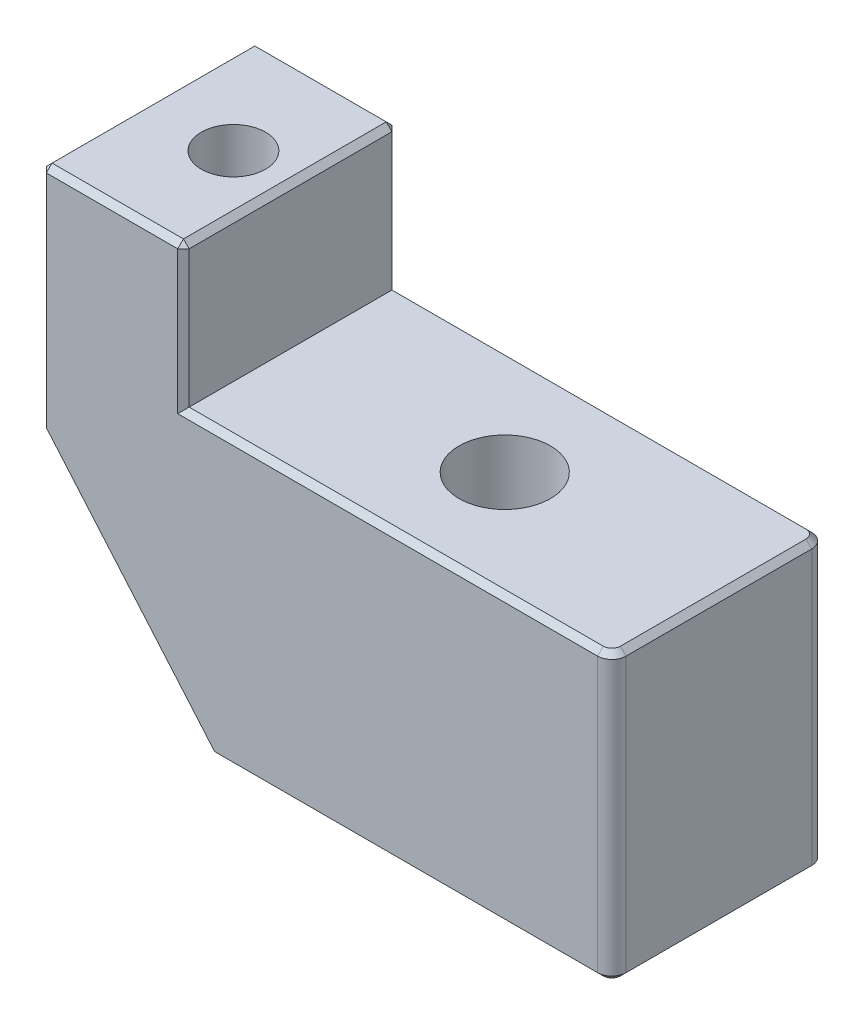
ISO-10303-21;
HEADER;
FILE_DESCRIPTION(('STEP AP214'),'2;1');
FILE_NAME('part.step','',(''),(''),'','','');
FILE_SCHEMA(('AUTOMOTIVE_DESIGN { 1 0 10303 214 1 1 1 1 }'));
ENDSEC;
DATA;
#1=APPLICATION_CONTEXT('core data for automotive mechanical design processes');
#2=APPLICATION_PROTOCOL_DEFINITION('international standard','automotive_design',2000,#1);
#3=PRODUCT_CONTEXT('',#1,'mechanical');
#4=PRODUCT('Part','Part','',(#3));
#5=PRODUCT_RELATED_PRODUCT_CATEGORY('part','',(#4));
#6=PRODUCT_DEFINITION_FORMATION('','',#4);
#7=PRODUCT_DEFINITION_CONTEXT('part definition',#1,'design');
#8=PRODUCT_DEFINITION('design','',#6,#7);
#9=PRODUCT_DEFINITION_SHAPE('','',#8);
#10=(LENGTH_UNIT() NAMED_UNIT(*) SI_UNIT(.MILLI.,.METRE.));
#11=(NAMED_UNIT(*) PLANE_ANGLE_UNIT() SI_UNIT($,.RADIAN.));
#12=(NAMED_UNIT(*) SI_UNIT($,.STERADIAN.) SOLID_ANGLE_UNIT());
#13=UNCERTAINTY_MEASURE_WITH_UNIT(LENGTH_MEASURE(1.E-05),#10,'distance_accuracy_value','');
#14=(GEOMETRIC_REPRESENTATION_CONTEXT(3) GLOBAL_UNCERTAINTY_ASSIGNED_CONTEXT((#13)) GLOBAL_UNIT_ASSIGNED_CONTEXT((#10,
#11,#12)) REPRESENTATION_CONTEXT('',''));
#15=CARTESIAN_POINT('',(0.,0.,0.));
#16=DIRECTION('',(0.,0.,1.));
#17=DIRECTION('',(1.,0.,0.));
#18=AXIS2_PLACEMENT_3D('',#15,#16,#17);
#19=CARTESIAN_POINT('',(0.,16.,7.5));
#20=DIRECTION('',(0.,-1.,0.));
#21=DIRECTION('',(0.,0.,-1.));
#22=AXIS2_PLACEMENT_3D('',#19,#20,#21);
#23=PLANE('',#22);
#24=DIRECTION('',(-1.,0.,0.));
#25=VECTOR('',#24,1.);
#26=CARTESIAN_POINT('',(0.,16.,-7.09999999999998));
#27=LINE('',#26,#25);
#28=CARTESIAN_POINT('',(9.59999999999998,16.,-7.09999999999998));
#29=VERTEX_POINT('',#28);
#30=CARTESIAN_POINT('',(0.400000000000018,16.,-7.09999999999998));
#31=VERTEX_POINT('',#30);
#32=EDGE_CURVE('E281',#29,#31,#27,.T.);
#33=ORIENTED_EDGE('',*,*,#32,.T.);
#34=DIRECTION('',(0.,0.,1.));
#35=VECTOR('',#34,1.);
#36=CARTESIAN_POINT('',(0.400000000000018,16.,7.5));
#37=LINE('',#36,#35);
#38=CARTESIAN_POINT('',(0.400000000000018,16.,7.09999999999998));
#39=VERTEX_POINT('',#38);
#40=EDGE_CURVE('E283',#31,#39,#37,.T.);
#41=ORIENTED_EDGE('',*,*,#40,.T.);
#42=DIRECTION('',(1.,0.,0.));
#43=VECTOR('',#42,1.);
#44=CARTESIAN_POINT('',(10.,16.,7.09999999999998));
#45=LINE('',#44,#43);
#46=CARTESIAN_POINT('',(9.59999999999998,16.,7.09999999999998));
#47=VERTEX_POINT('',#46);
#48=EDGE_CURVE('E279',#39,#47,#45,.T.);
#49=ORIENTED_EDGE('',*,*,#48,.T.);
#50=DIRECTION('',(0.,0.,-1.));
#51=VECTOR('',#50,1.);
#52=CARTESIAN_POINT('',(9.59999999999998,16.,7.5));
#53=LINE('',#52,#51);
#54=EDGE_CURVE('E277',#47,#29,#53,.T.);
#55=ORIENTED_EDGE('',*,*,#54,.T.);
#56=EDGE_LOOP('',(#33,#41,#49,#55));
#57=FACE_BOUND('',#56,.T.);
#58=CARTESIAN_POINT('',(6.,16.,0.));
#59=DIRECTION('',(0.,-1.,0.));
#60=DIRECTION('',(0.,0.,-1.));
#61=AXIS2_PLACEMENT_3D('',#58,#59,#60);
#62=CIRCLE('',#61,2.24999999999999);
#63=CARTESIAN_POINT('',(6.,16.,-2.24999999999999));
#64=VERTEX_POINT('',#63);
#65=EDGE_CURVE('E366',#64,#64,#62,.T.);
#66=ORIENTED_EDGE('',*,*,#65,.T.);
#67=EDGE_LOOP('',(#66));
#68=FACE_BOUND('',#67,.T.);
#69=ADVANCED_FACE('F39',(#57,#68),#23,.F.);
#70=CARTESIAN_POINT('',(12.,-14.,7.5));
#71=DIRECTION('',(0.,1.,0.));
#72=DIRECTION('',(0.,0.,1.));
#73=AXIS2_PLACEMENT_3D('',#70,#71,#72);
#74=PLANE('',#73);
#75=CARTESIAN_POINT('',(39.,-14.,6.5));
#76=DIRECTION('',(0.,1.,0.));
#77=DIRECTION('',(0.,0.,1.));
#78=AXIS2_PLACEMENT_3D('',#75,#76,#77);
#79=CIRCLE('',#78,0.599999999999982);
#80=CARTESIAN_POINT('',(39.6,-14.,6.5));
#81=VERTEX_POINT('',#80);
#82=CARTESIAN_POINT('',(39.,-14.,7.09999999999998));
#83=VERTEX_POINT('',#82);
#84=EDGE_CURVE('E242',#81,#83,#79,.F.);
#85=ORIENTED_EDGE('',*,*,#84,.T.);
#86=DIRECTION('',(-1.,0.,0.));
#87=VECTOR('',#86,1.);
#88=CARTESIAN_POINT('',(12.,-14.,7.09999999999998));
#89=LINE('',#88,#87);
#90=CARTESIAN_POINT('',(12.,-14.,7.09999999999998));
#91=VERTEX_POINT('',#90);
#92=EDGE_CURVE('E244',#83,#91,#89,.T.);
#93=ORIENTED_EDGE('',*,*,#92,.T.);
#94=DIRECTION('',(0.,0.,-1.));
#95=VECTOR('',#94,1.);
#96=CARTESIAN_POINT('',(12.,-14.,7.5));
#97=LINE('',#96,#95);
#98=CARTESIAN_POINT('',(12.,-14.,-7.09999999999998));
#99=VERTEX_POINT('',#98);
#100=EDGE_CURVE('E188',#91,#99,#97,.T.);
#101=ORIENTED_EDGE('',*,*,#100,.T.);
#102=DIRECTION('',(1.,0.,0.));
#103=VECTOR('',#102,1.);
#104=CARTESIAN_POINT('',(12.,-14.,-7.09999999999998));
#105=LINE('',#104,#103);
#106=CARTESIAN_POINT('',(39.,-14.,-7.09999999999998));
#107=VERTEX_POINT('',#106);
#108=EDGE_CURVE('E236',#99,#107,#105,.T.);
#109=ORIENTED_EDGE('',*,*,#108,.T.);
#110=CARTESIAN_POINT('',(39.,-14.,-6.5));
#111=DIRECTION('',(0.,1.,0.));
#112=DIRECTION('',(0.,0.,1.));
#113=AXIS2_PLACEMENT_3D('',#110,#111,#112);
#114=CIRCLE('',#113,0.599999999999983);
#115=CARTESIAN_POINT('',(39.6,-14.,-6.5));
#116=VERTEX_POINT('',#115);
#117=EDGE_CURVE('E238',#107,#116,#114,.F.);
#118=ORIENTED_EDGE('',*,*,#117,.T.);
#119=DIRECTION('',(0.,0.,1.));
#120=VECTOR('',#119,1.);
#121=CARTESIAN_POINT('',(39.6,-14.,7.5));
#122=LINE('',#121,#120);
#123=EDGE_CURVE('E240',#116,#81,#122,.T.);
#124=ORIENTED_EDGE('',*,*,#123,.T.);
#125=EDGE_LOOP('',(#85,#93,#101,#109,#118,#124));
#126=FACE_BOUND('',#125,.T.);
#127=CARTESIAN_POINT('',(25.,-14.,0.));
#128=DIRECTION('',(0.,-1.,0.));
#129=DIRECTION('',(0.,0.,-1.));
#130=AXIS2_PLACEMENT_3D('',#127,#128,#129);
#131=CIRCLE('',#130,5.5);
#132=CARTESIAN_POINT('',(25.,-14.,-5.49999999999999));
#133=VERTEX_POINT('',#132);
#134=EDGE_CURVE('E372',#133,#133,#131,.T.);
#135=ORIENTED_EDGE('',*,*,#134,.F.);
#136=EDGE_LOOP('',(#135));
#137=FACE_BOUND('',#136,.T.);
#138=ADVANCED_FACE('F513',(#126,#137),#74,.F.);
#139=CARTESIAN_POINT('',(0.,0.,7.5));
#140=DIRECTION('',(0.759256602365297,0.650791373455968,0.));
#141=DIRECTION('',(-0.650791373455968,0.759256602365297,0.));
#142=AXIS2_PLACEMENT_3D('',#139,#140,#141);
#143=PLANE('',#142);
#144=CARTESIAN_POINT('',(6.,-7.,0.));
#145=DIRECTION('',(0.759256602365297,0.650791373455968,0.));
#146=DIRECTION('',(0.650791373455968,-0.759256602365297,0.));
#147=AXIS2_PLACEMENT_3D('',#144,#145,#146);
#148=ELLIPSE('',#147,6.14636297152859,4.);
#149=CARTESIAN_POINT('',(10.,-11.6666666666667,0.));
#150=VERTEX_POINT('',#149);
#151=EDGE_CURVE('E371',#150,#150,#148,.T.);
#152=ORIENTED_EDGE('',*,*,#151,.T.);
#153=EDGE_LOOP('',(#152));
#154=FACE_BOUND('',#153,.T.);
#155=ORIENTED_EDGE('',*,*,#100,.F.);
#156=DIRECTION('',(-0.650791373455968,0.759256602365297,0.));
#157=VECTOR('',#156,1.);
#158=CARTESIAN_POINT('',(0.,0.,7.09999999999998));
#159=LINE('',#158,#157);
#160=CARTESIAN_POINT('',(0.,0.,7.09999999999998));
#161=VERTEX_POINT('',#160);
#162=EDGE_CURVE('E269',#91,#161,#159,.T.);
#163=ORIENTED_EDGE('',*,*,#162,.T.);
#164=DIRECTION('',(0.,0.,-1.));
#165=VECTOR('',#164,1.);
#166=CARTESIAN_POINT('',(0.,0.,7.5));
#167=LINE('',#166,#165);
#168=CARTESIAN_POINT('',(0.,0.,-7.09999999999998));
#169=VERTEX_POINT('',#168);
#170=EDGE_CURVE('E189',#161,#169,#167,.T.);
#171=ORIENTED_EDGE('',*,*,#170,.T.);
#172=DIRECTION('',(0.650791373455968,-0.759256602365297,0.));
#173=VECTOR('',#172,1.);
#174=CARTESIAN_POINT('',(0.,0.,-7.09999999999998));
#175=LINE('',#174,#173);
#176=EDGE_CURVE('E267',#169,#99,#175,.T.);
#177=ORIENTED_EDGE('',*,*,#176,.T.);
#178=EDGE_LOOP('',(#155,#163,#171,#177));
#179=FACE_BOUND('',#178,.T.);
#180=ADVANCED_FACE('F476',(#154,#179),#143,.F.);
#181=CARTESIAN_POINT('',(40.,6.,7.5));
#182=DIRECTION('',(-1.,0.,0.));
#183=DIRECTION('',(0.,-1.,0.));
#184=AXIS2_PLACEMENT_3D('',#181,#182,#183);
#185=PLANE('',#184);
#186=DIRECTION('',(0.,1.,0.));
#187=VECTOR('',#186,1.);
#188=CARTESIAN_POINT('',(40.,6.,-6.5));
#189=LINE('',#188,#187);
#190=CARTESIAN_POINT('',(40.,-13.6,-6.5));
#191=VERTEX_POINT('',#190);
#192=CARTESIAN_POINT('',(40.,5.59999999999998,-6.5));
#193=VERTEX_POINT('',#192);
#194=EDGE_CURVE('E393',#191,#193,#189,.T.);
#195=ORIENTED_EDGE('',*,*,#194,.T.);
#196=DIRECTION('',(0.,0.,1.));
#197=VECTOR('',#196,1.);
#198=CARTESIAN_POINT('',(40.,5.6,7.5));
#199=LINE('',#198,#197);
#200=CARTESIAN_POINT('',(40.,5.59999999999998,6.5));
#201=VERTEX_POINT('',#200);
#202=EDGE_CURVE('E222',#193,#201,#199,.T.);
#203=ORIENTED_EDGE('',*,*,#202,.T.);
#204=DIRECTION('',(0.,1.,0.));
#205=VECTOR('',#204,1.);
#206=CARTESIAN_POINT('',(40.,-14.,6.5));
#207=LINE('',#206,#205);
#208=CARTESIAN_POINT('',(40.,-13.6,6.5));
#209=VERTEX_POINT('',#208);
#210=EDGE_CURVE('E388',#201,#209,#207,.F.);
#211=ORIENTED_EDGE('',*,*,#210,.T.);
#212=DIRECTION('',(0.,0.,-1.));
#213=VECTOR('',#212,1.);
#214=CARTESIAN_POINT('',(40.,-13.6,7.5));
#215=LINE('',#214,#213);
#216=EDGE_CURVE('E220',#209,#191,#215,.T.);
#217=ORIENTED_EDGE('',*,*,#216,.T.);
#218=EDGE_LOOP('',(#195,#203,#211,#217));
#219=FACE_BOUND('',#218,.T.);
#220=ADVANCED_FACE('F447',(#219),#185,.F.);
#221=CARTESIAN_POINT('',(10.,6.,7.5));
#222=DIRECTION('',(0.,-1.,0.));
#223=DIRECTION('',(0.,0.,-1.));
#224=AXIS2_PLACEMENT_3D('',#221,#222,#223);
#225=PLANE('',#224);
#226=CARTESIAN_POINT('',(25.,6.,0.));
#227=DIRECTION('',(0.,-1.,0.));
#228=DIRECTION('',(0.,0.,-1.));
#229=AXIS2_PLACEMENT_3D('',#226,#227,#228);
#230=CIRCLE('',#229,3.2);
#231=CARTESIAN_POINT('',(25.,6.,-3.19999999999999));
#232=VERTEX_POINT('',#231);
#233=EDGE_CURVE('E381',#232,#232,#230,.T.);
#234=ORIENTED_EDGE('',*,*,#233,.T.);
#235=EDGE_LOOP('',(#234));
#236=FACE_BOUND('',#235,.T.);
#237=CARTESIAN_POINT('',(39.,6.,-6.5));
#238=DIRECTION('',(0.,-1.,0.));
#239=DIRECTION('',(0.,0.,-1.));
#240=AXIS2_PLACEMENT_3D('',#237,#238,#239);
#241=CIRCLE('',#240,0.599999999999982);
#242=CARTESIAN_POINT('',(39.6,6.,-6.5));
#243=VERTEX_POINT('',#242);
#244=CARTESIAN_POINT('',(39.,6.,-7.09999999999998));
#245=VERTEX_POINT('',#244);
#246=EDGE_CURVE('E217',#243,#245,#241,.F.);
#247=ORIENTED_EDGE('',*,*,#246,.T.);
#248=DIRECTION('',(-1.,0.,0.));
#249=VECTOR('',#248,1.);
#250=CARTESIAN_POINT('',(10.,6.,-7.09999999999998));
#251=LINE('',#250,#249);
#252=CARTESIAN_POINT('',(10.,6.,-7.09999999999998));
#253=VERTEX_POINT('',#252);
#254=EDGE_CURVE('E187',#245,#253,#251,.T.);
#255=ORIENTED_EDGE('',*,*,#254,.T.);
#256=DIRECTION('',(0.,0.,-1.));
#257=VECTOR('',#256,1.);
#258=CARTESIAN_POINT('',(10.,6.,7.5));
#259=LINE('',#258,#257);
#260=CARTESIAN_POINT('',(10.,6.,7.09999999999998));
#261=VERTEX_POINT('',#260);
#262=EDGE_CURVE('E176',#261,#253,#259,.T.);
#263=ORIENTED_EDGE('',*,*,#262,.F.);
#264=DIRECTION('',(1.,0.,0.));
#265=VECTOR('',#264,1.);
#266=CARTESIAN_POINT('',(39.,6.,7.09999999999998));
#267=LINE('',#266,#265);
#268=CARTESIAN_POINT('',(39.,6.,7.09999999999998));
#269=VERTEX_POINT('',#268);
#270=EDGE_CURVE('E184',#261,#269,#267,.T.);
#271=ORIENTED_EDGE('',*,*,#270,.T.);
#272=CARTESIAN_POINT('',(39.,6.,6.5));
#273=DIRECTION('',(0.,-1.,0.));
#274=DIRECTION('',(0.,0.,-1.));
#275=AXIS2_PLACEMENT_3D('',#272,#273,#274);
#276=CIRCLE('',#275,0.599999999999983);
#277=CARTESIAN_POINT('',(39.6,6.,6.5));
#278=VERTEX_POINT('',#277);
#279=EDGE_CURVE('E205',#269,#278,#276,.F.);
#280=ORIENTED_EDGE('',*,*,#279,.T.);
#281=DIRECTION('',(0.,0.,-1.));
#282=VECTOR('',#281,1.);
#283=CARTESIAN_POINT('',(39.6,6.,7.5));
#284=LINE('',#283,#282);
#285=EDGE_CURVE('E208',#278,#243,#284,.T.);
#286=ORIENTED_EDGE('',*,*,#285,.T.);
#287=EDGE_LOOP('',(#247,#255,#263,#271,#280,#286));
#288=FACE_BOUND('',#287,.T.);
#289=ADVANCED_FACE('F182',(#236,#288),#225,.F.);
#290=CARTESIAN_POINT('',(10.,16.,7.5));
#291=DIRECTION('',(-1.,0.,0.));
#292=DIRECTION('',(0.,-1.,0.));
#293=AXIS2_PLACEMENT_3D('',#290,#291,#292);
#294=PLANE('',#293);
#295=ORIENTED_EDGE('',*,*,#262,.T.);
#296=DIRECTION('',(0.,1.,0.));
#297=VECTOR('',#296,1.);
#298=CARTESIAN_POINT('',(10.,16.,-7.09999999999998));
#299=LINE('',#298,#297);
#300=CARTESIAN_POINT('',(10.,15.6,-7.09999999999998));
#301=VERTEX_POINT('',#300);
#302=EDGE_CURVE('E11',#253,#301,#299,.T.);
#303=ORIENTED_EDGE('',*,*,#302,.T.);
#304=DIRECTION('',(0.,0.,1.));
#305=VECTOR('',#304,1.);
#306=CARTESIAN_POINT('',(10.,15.6,7.5));
#307=LINE('',#306,#305);
#308=CARTESIAN_POINT('',(10.,15.6,7.09999999999998));
#309=VERTEX_POINT('',#308);
#310=EDGE_CURVE('E56',#301,#309,#307,.T.);
#311=ORIENTED_EDGE('',*,*,#310,.T.);
#312=DIRECTION('',(0.,-1.,0.));
#313=VECTOR('',#312,1.);
#314=CARTESIAN_POINT('',(10.,6.,7.09999999999998));
#315=LINE('',#314,#313);
#316=EDGE_CURVE('E49',#309,#261,#315,.T.);
#317=ORIENTED_EDGE('',*,*,#316,.T.);
#318=EDGE_LOOP('',(#295,#303,#311,#317));
#319=FACE_BOUND('',#318,.T.);
#320=ADVANCED_FACE('F175',(#319),#294,.F.);
#321=CARTESIAN_POINT('',(0.,0.,7.5));
#322=DIRECTION('',(1.,0.,0.));
#323=DIRECTION('',(0.,0.,-1.));
#324=AXIS2_PLACEMENT_3D('',#321,#322,#323);
#325=PLANE('',#324);
#326=ORIENTED_EDGE('',*,*,#170,.F.);
#327=DIRECTION('',(0.,1.,0.));
#328=VECTOR('',#327,1.);
#329=CARTESIAN_POINT('',(0.,16.,7.09999999999998));
#330=LINE('',#329,#328);
#331=CARTESIAN_POINT('',(0.,15.6,7.09999999999998));
#332=VERTEX_POINT('',#331);
#333=EDGE_CURVE('E275',#161,#332,#330,.T.);
#334=ORIENTED_EDGE('',*,*,#333,.T.);
#335=DIRECTION('',(0.,0.,-1.));
#336=VECTOR('',#335,1.);
#337=CARTESIAN_POINT('',(0.,15.6,7.5));
#338=LINE('',#337,#336);
#339=CARTESIAN_POINT('',(0.,15.6,-7.09999999999998));
#340=VERTEX_POINT('',#339);
#341=EDGE_CURVE('E271',#332,#340,#338,.T.);
#342=ORIENTED_EDGE('',*,*,#341,.T.);
#343=DIRECTION('',(0.,-1.,0.));
#344=VECTOR('',#343,1.);
#345=CARTESIAN_POINT('',(0.,0.,-7.09999999999998));
#346=LINE('',#345,#344);
#347=EDGE_CURVE('E273',#340,#169,#346,.T.);
#348=ORIENTED_EDGE('',*,*,#347,.T.);
#349=EDGE_LOOP('',(#326,#334,#342,#348));
#350=FACE_BOUND('',#349,.T.);
#351=ADVANCED_FACE('F478',(#350),#325,.F.);
#352=CARTESIAN_POINT('',(0.,0.,7.5));
#353=DIRECTION('',(0.,0.,1.));
#354=DIRECTION('',(1.,0.,0.));
#355=AXIS2_PLACEMENT_3D('',#352,#353,#354);
#356=PLANE('',#355);
#357=DIRECTION('',(0.650791373455969,-0.759256602365297,0.));
#358=VECTOR('',#357,1.);
#359=CARTESIAN_POINT('',(12.3037026409461,-13.7396834506176,7.5));
#360=LINE('',#359,#358);
#361=CARTESIAN_POINT('',(0.400000000000018,0.147969630486194,7.5));
#362=VERTEX_POINT('',#361);
#363=CARTESIAN_POINT('',(12.1839739689882,-13.6,7.5));
#364=VERTEX_POINT('',#363);
#365=EDGE_CURVE('E232',#362,#364,#360,.T.);
#366=ORIENTED_EDGE('',*,*,#365,.T.);
#367=DIRECTION('',(1.,0.,0.));
#368=VECTOR('',#367,1.);
#369=CARTESIAN_POINT('',(39.,-13.6,7.5));
#370=LINE('',#369,#368);
#371=CARTESIAN_POINT('',(39.,-13.6,7.5));
#372=VERTEX_POINT('',#371);
#373=EDGE_CURVE('E234',#364,#372,#370,.T.);
#374=ORIENTED_EDGE('',*,*,#373,.T.);
#375=DIRECTION('',(0.,1.,0.));
#376=VECTOR('',#375,1.);
#377=CARTESIAN_POINT('',(39.,6.,7.5));
#378=LINE('',#377,#376);
#379=CARTESIAN_POINT('',(39.,5.59999999999998,7.5));
#380=VERTEX_POINT('',#379);
#381=EDGE_CURVE('E206',#372,#380,#378,.T.);
#382=ORIENTED_EDGE('',*,*,#381,.T.);
#383=DIRECTION('',(-1.,0.,0.));
#384=VECTOR('',#383,1.);
#385=CARTESIAN_POINT('',(10.,5.59999999999998,7.5));
#386=LINE('',#385,#384);
#387=CARTESIAN_POINT('',(9.59999999999999,5.59999999999998,7.5));
#388=VERTEX_POINT('',#387);
#389=EDGE_CURVE('E228',#380,#388,#386,.T.);
#390=ORIENTED_EDGE('',*,*,#389,.T.);
#391=DIRECTION('',(0.,1.,0.));
#392=VECTOR('',#391,1.);
#393=CARTESIAN_POINT('',(9.59999999999998,16.,7.5));
#394=LINE('',#393,#392);
#395=CARTESIAN_POINT('',(9.59999999999998,15.6,7.5));
#396=VERTEX_POINT('',#395);
#397=EDGE_CURVE('E195',#388,#396,#394,.T.);
#398=ORIENTED_EDGE('',*,*,#397,.T.);
#399=DIRECTION('',(-1.,0.,0.));
#400=VECTOR('',#399,1.);
#401=CARTESIAN_POINT('',(0.,15.6,7.5));
#402=LINE('',#401,#400);
#403=CARTESIAN_POINT('',(0.400000000000018,15.6,7.5));
#404=VERTEX_POINT('',#403);
#405=EDGE_CURVE('E225',#396,#404,#402,.T.);
#406=ORIENTED_EDGE('',*,*,#405,.T.);
#407=DIRECTION('',(0.,-1.,0.));
#408=VECTOR('',#407,1.);
#409=CARTESIAN_POINT('',(0.400000000000018,0.,7.5));
#410=LINE('',#409,#408);
#411=EDGE_CURVE('E230',#404,#362,#410,.T.);
#412=ORIENTED_EDGE('',*,*,#411,.T.);
#413=EDGE_LOOP('',(#366,#374,#382,#390,#398,#406,#412));
#414=FACE_BOUND('',#413,.T.);
#415=ADVANCED_FACE('F461',(#414),#356,.T.);
#416=CARTESIAN_POINT('',(0.,0.,-7.5));
#417=DIRECTION('',(0.,0.,1.));
#418=DIRECTION('',(1.,0.,0.));
#419=AXIS2_PLACEMENT_3D('',#416,#417,#418);
#420=PLANE('',#419);
#421=DIRECTION('',(0.,1.,0.));
#422=VECTOR('',#421,1.);
#423=CARTESIAN_POINT('',(39.,0.,-7.5));
#424=LINE('',#423,#422);
#425=CARTESIAN_POINT('',(39.,5.59999999999998,-7.5));
#426=VERTEX_POINT('',#425);
#427=CARTESIAN_POINT('',(39.,-13.6,-7.5));
#428=VERTEX_POINT('',#427);
#429=EDGE_CURVE('E211',#426,#428,#424,.F.);
#430=ORIENTED_EDGE('',*,*,#429,.T.);
#431=DIRECTION('',(-1.,0.,0.));
#432=VECTOR('',#431,1.);
#433=CARTESIAN_POINT('',(0.,-13.6,-7.5));
#434=LINE('',#433,#432);
#435=CARTESIAN_POINT('',(12.1839739689882,-13.6,-7.5));
#436=VERTEX_POINT('',#435);
#437=EDGE_CURVE('E265',#428,#436,#434,.T.);
#438=ORIENTED_EDGE('',*,*,#437,.T.);
#439=DIRECTION('',(-0.650791373455969,0.759256602365297,0.));
#440=VECTOR('',#439,1.);
#441=CARTESIAN_POINT('',(0.303702640946132,0.260316549382399,-7.5));
#442=LINE('',#441,#440);
#443=CARTESIAN_POINT('',(0.400000000000018,0.147969630486198,-7.5));
#444=VERTEX_POINT('',#443);
#445=EDGE_CURVE('E263',#436,#444,#442,.T.);
#446=ORIENTED_EDGE('',*,*,#445,.T.);
#447=DIRECTION('',(0.,1.,0.));
#448=VECTOR('',#447,1.);
#449=CARTESIAN_POINT('',(0.400000000000018,0.,-7.5));
#450=LINE('',#449,#448);
#451=CARTESIAN_POINT('',(0.400000000000018,15.6,-7.5));
#452=VERTEX_POINT('',#451);
#453=EDGE_CURVE('E261',#444,#452,#450,.T.);
#454=ORIENTED_EDGE('',*,*,#453,.T.);
#455=DIRECTION('',(1.,0.,0.));
#456=VECTOR('',#455,1.);
#457=CARTESIAN_POINT('',(0.,15.6,-7.5));
#458=LINE('',#457,#456);
#459=CARTESIAN_POINT('',(9.59999999999998,15.6,-7.5));
#460=VERTEX_POINT('',#459);
#461=EDGE_CURVE('E255',#452,#460,#458,.T.);
#462=ORIENTED_EDGE('',*,*,#461,.T.);
#463=DIRECTION('',(0.,-1.,0.));
#464=VECTOR('',#463,1.);
#465=CARTESIAN_POINT('',(9.59999999999999,0.,-7.5));
#466=LINE('',#465,#464);
#467=CARTESIAN_POINT('',(9.59999999999999,5.59999999999998,-7.5));
#468=VERTEX_POINT('',#467);
#469=EDGE_CURVE('E257',#460,#468,#466,.T.);
#470=ORIENTED_EDGE('',*,*,#469,.T.);
#471=DIRECTION('',(1.,0.,0.));
#472=VECTOR('',#471,1.);
#473=CARTESIAN_POINT('',(0.,5.59999999999998,-7.5));
#474=LINE('',#473,#472);
#475=EDGE_CURVE('E259',#468,#426,#474,.T.);
#476=ORIENTED_EDGE('',*,*,#475,.T.);
#477=EDGE_LOOP('',(#430,#438,#446,#454,#462,#470,#476));
#478=FACE_BOUND('',#477,.T.);
#479=ADVANCED_FACE('F399',(#478),#420,.F.);
#480=CARTESIAN_POINT('',(25.,-14.,0.));
#481=DIRECTION('',(0.,-1.,0.));
#482=DIRECTION('',(0.,0.,-1.));
#483=AXIS2_PLACEMENT_3D('',#480,#481,#482);
#484=CYLINDRICAL_SURFACE('',#483,3.2);
#485=ORIENTED_EDGE('',*,*,#233,.F.);
#486=EDGE_LOOP('',(#485));
#487=FACE_BOUND('',#486,.T.);
#488=CARTESIAN_POINT('',(25.,-7.6,0.));
#489=DIRECTION('',(0.,-1.,0.));
#490=DIRECTION('',(0.,0.,-1.));
#491=AXIS2_PLACEMENT_3D('',#488,#489,#490);
#492=CIRCLE('',#491,3.2);
#493=CARTESIAN_POINT('',(25.,-7.6,-3.2));
#494=VERTEX_POINT('',#493);
#495=EDGE_CURVE('E378',#494,#494,#492,.T.);
#496=ORIENTED_EDGE('',*,*,#495,.T.);
#497=EDGE_LOOP('',(#496));
#498=FACE_BOUND('',#497,.T.);
#499=ADVANCED_FACE('F659',(#487,#498),#484,.F.);
#500=CARTESIAN_POINT('',(28.2,-7.6,0.));
#501=DIRECTION('',(0.,1.,0.));
#502=DIRECTION('',(0.,0.,1.));
#503=AXIS2_PLACEMENT_3D('',#500,#501,#502);
#504=PLANE('',#503);
#505=ORIENTED_EDGE('',*,*,#495,.F.);
#506=EDGE_LOOP('',(#505));
#507=FACE_BOUND('',#506,.T.);
#508=CARTESIAN_POINT('',(25.,-7.6,0.));
#509=DIRECTION('',(0.,-1.,0.));
#510=DIRECTION('',(0.,0.,-1.));
#511=AXIS2_PLACEMENT_3D('',#508,#509,#510);
#512=CIRCLE('',#511,5.5);
#513=CARTESIAN_POINT('',(25.,-7.6,-5.49999999999999));
#514=VERTEX_POINT('',#513);
#515=EDGE_CURVE('E375',#514,#514,#512,.T.);
#516=ORIENTED_EDGE('',*,*,#515,.T.);
#517=EDGE_LOOP('',(#516));
#518=FACE_BOUND('',#517,.T.);
#519=ADVANCED_FACE('F649',(#507,#518),#504,.F.);
#520=CARTESIAN_POINT('',(25.,-14.,0.));
#521=DIRECTION('',(0.,-1.,0.));
#522=DIRECTION('',(0.,0.,-1.));
#523=AXIS2_PLACEMENT_3D('',#520,#521,#522);
#524=CYLINDRICAL_SURFACE('',#523,5.5);
#525=ORIENTED_EDGE('',*,*,#515,.F.);
#526=EDGE_LOOP('',(#525));
#527=FACE_BOUND('',#526,.T.);
#528=ORIENTED_EDGE('',*,*,#134,.T.);
#529=EDGE_LOOP('',(#528));
#530=FACE_BOUND('',#529,.T.);
#531=ADVANCED_FACE('F646',(#527,#530),#524,.F.);
#532=CARTESIAN_POINT('',(6.,-14.,0.));
#533=DIRECTION('',(0.,-1.,0.));
#534=DIRECTION('',(0.,0.,-1.));
#535=AXIS2_PLACEMENT_3D('',#532,#533,#534);
#536=CYLINDRICAL_SURFACE('',#535,4.);
#537=CARTESIAN_POINT('',(6.,2.4,0.));
#538=DIRECTION('',(0.,-1.,0.));
#539=DIRECTION('',(0.,0.,-1.));
#540=AXIS2_PLACEMENT_3D('',#537,#538,#539);
#541=CIRCLE('',#540,4.);
#542=CARTESIAN_POINT('',(6.,2.4,-4.));
#543=VERTEX_POINT('',#542);
#544=EDGE_CURVE('E355',#543,#543,#541,.T.);
#545=ORIENTED_EDGE('',*,*,#544,.F.);
#546=EDGE_LOOP('',(#545));
#547=FACE_BOUND('',#546,.T.);
#548=ORIENTED_EDGE('',*,*,#151,.F.);
#549=EDGE_LOOP('',(#548));
#550=FACE_BOUND('',#549,.T.);
#551=ADVANCED_FACE('F648',(#547,#550),#536,.F.);
#552=CARTESIAN_POINT('',(6.,-14.,0.));
#553=DIRECTION('',(0.,-1.,0.));
#554=DIRECTION('',(0.,0.,-1.));
#555=AXIS2_PLACEMENT_3D('',#552,#553,#554);
#556=CYLINDRICAL_SURFACE('',#555,2.25);
#557=ORIENTED_EDGE('',*,*,#65,.F.);
#558=EDGE_LOOP('',(#557));
#559=FACE_BOUND('',#558,.T.);
#560=CARTESIAN_POINT('',(6.,2.4,0.));
#561=DIRECTION('',(0.,-1.,0.));
#562=DIRECTION('',(0.,0.,-1.));
#563=AXIS2_PLACEMENT_3D('',#560,#561,#562);
#564=CIRCLE('',#563,2.25);
#565=CARTESIAN_POINT('',(6.,2.4,-2.25));
#566=VERTEX_POINT('',#565);
#567=EDGE_CURVE('E361',#566,#566,#564,.T.);
#568=ORIENTED_EDGE('',*,*,#567,.T.);
#569=EDGE_LOOP('',(#568));
#570=FACE_BOUND('',#569,.T.);
#571=ADVANCED_FACE('F656',(#559,#570),#556,.F.);
#572=CARTESIAN_POINT('',(8.25,2.4,0.));
#573=DIRECTION('',(0.,1.,0.));
#574=DIRECTION('',(0.,0.,1.));
#575=AXIS2_PLACEMENT_3D('',#572,#573,#574);
#576=PLANE('',#575);
#577=ORIENTED_EDGE('',*,*,#567,.F.);
#578=EDGE_LOOP('',(#577));
#579=FACE_BOUND('',#578,.T.);
#580=ORIENTED_EDGE('',*,*,#544,.T.);
#581=EDGE_LOOP('',(#580));
#582=FACE_BOUND('',#581,.T.);
#583=ADVANCED_FACE('F535',(#579,#582),#576,.F.);
#584=CARTESIAN_POINT('',(39.,6.,-6.5));
#585=DIRECTION('',(0.,1.,0.));
#586=DIRECTION('',(-1.,0.,0.));
#587=AXIS2_PLACEMENT_3D('',#584,#585,#586);
#588=CYLINDRICAL_SURFACE('',#587,1.);
#589=ORIENTED_EDGE('',*,*,#194,.F.);
#590=CARTESIAN_POINT('',(39.,-13.6,-6.5));
#591=DIRECTION('',(0.,1.,0.));
#592=DIRECTION('',(0.,0.,1.));
#593=AXIS2_PLACEMENT_3D('',#590,#591,#592);
#594=CIRCLE('',#593,1.);
#595=EDGE_CURVE('E253',#191,#428,#594,.T.);
#596=ORIENTED_EDGE('',*,*,#595,.T.);
#597=ORIENTED_EDGE('',*,*,#429,.F.);
#598=CARTESIAN_POINT('',(39.,5.59999999999998,-6.5));
#599=DIRECTION('',(0.,-1.,0.));
#600=DIRECTION('',(0.,0.,-1.));
#601=AXIS2_PLACEMENT_3D('',#598,#599,#600);
#602=CIRCLE('',#601,1.);
#603=EDGE_CURVE('E251',#426,#193,#602,.T.);
#604=ORIENTED_EDGE('',*,*,#603,.T.);
#605=EDGE_LOOP('',(#589,#596,#597,#604));
#606=FACE_BOUND('',#605,.T.);
#607=ADVANCED_FACE('F444',(#606),#588,.T.);
#608=CARTESIAN_POINT('',(39.,0.,6.5));
#609=DIRECTION('',(0.,-1.,0.));
#610=DIRECTION('',(1.,0.,0.));
#611=AXIS2_PLACEMENT_3D('',#608,#609,#610);
#612=CYLINDRICAL_SURFACE('',#611,1.);
#613=ORIENTED_EDGE('',*,*,#381,.F.);
#614=CARTESIAN_POINT('',(39.,-13.6,6.5));
#615=DIRECTION('',(0.,1.,0.));
#616=DIRECTION('',(0.,0.,1.));
#617=AXIS2_PLACEMENT_3D('',#614,#615,#616);
#618=CIRCLE('',#617,1.);
#619=EDGE_CURVE('E249',#372,#209,#618,.T.);
#620=ORIENTED_EDGE('',*,*,#619,.T.);
#621=ORIENTED_EDGE('',*,*,#210,.F.);
#622=CARTESIAN_POINT('',(39.,5.59999999999998,6.5));
#623=DIRECTION('',(0.,-1.,0.));
#624=DIRECTION('',(0.,0.,-1.));
#625=AXIS2_PLACEMENT_3D('',#622,#623,#624);
#626=CIRCLE('',#625,1.);
#627=EDGE_CURVE('E247',#201,#380,#626,.T.);
#628=ORIENTED_EDGE('',*,*,#627,.T.);
#629=EDGE_LOOP('',(#613,#620,#621,#628));
#630=FACE_BOUND('',#629,.T.);
#631=ADVANCED_FACE('F459',(#630),#612,.T.);
#632=CARTESIAN_POINT('',(40.,-13.6,7.5));
#633=DIRECTION('',(-0.707106781186547,0.707106781186547,0.));
#634=DIRECTION('',(0.,0.,-1.));
#635=AXIS2_PLACEMENT_3D('',#632,#633,#634);
#636=PLANE('',#635);
#637=DIRECTION('',(-0.707106781186546,-0.707106781186549,0.));
#638=VECTOR('',#637,1.);
#639=CARTESIAN_POINT('',(40.,-13.6,-6.5));
#640=LINE('',#639,#638);
#641=EDGE_CURVE('E348',#191,#116,#640,.T.);
#642=ORIENTED_EDGE('',*,*,#641,.F.);
#643=ORIENTED_EDGE('',*,*,#216,.F.);
#644=DIRECTION('',(0.707106781186546,0.707106781186549,0.));
#645=VECTOR('',#644,1.);
#646=CARTESIAN_POINT('',(39.6,-14.,6.5));
#647=LINE('',#646,#645);
#648=EDGE_CURVE('E44',#81,#209,#647,.T.);
#649=ORIENTED_EDGE('',*,*,#648,.F.);
#650=ORIENTED_EDGE('',*,*,#123,.F.);
#651=EDGE_LOOP('',(#642,#643,#649,#650));
#652=FACE_BOUND('',#651,.T.);
#653=ADVANCED_FACE('F42',(#652),#636,.F.);
#654=CARTESIAN_POINT('',(39.,-14.,6.5));
#655=DIRECTION('',(0.,1.,0.));
#656=DIRECTION('',(0.,0.,1.));
#657=AXIS2_PLACEMENT_3D('',#654,#655,#656);
#658=CONICAL_SURFACE('',#657,0.599999999999982,0.785398163397448);
#659=ORIENTED_EDGE('',*,*,#648,.T.);
#660=ORIENTED_EDGE('',*,*,#619,.F.);
#661=DIRECTION('',(0.,0.707106781186549,0.707106781186546));
#662=VECTOR('',#661,1.);
#663=CARTESIAN_POINT('',(39.,-14.,7.09999999999998));
#664=LINE('',#663,#662);
#665=EDGE_CURVE('E346',#83,#372,#664,.T.);
#666=ORIENTED_EDGE('',*,*,#665,.F.);
#667=ORIENTED_EDGE('',*,*,#84,.F.);
#668=EDGE_LOOP('',(#659,#660,#666,#667));
#669=FACE_BOUND('',#668,.T.);
#670=ADVANCED_FACE('F631',(#669),#658,.T.);
#671=CARTESIAN_POINT('',(39.,-14.,-6.5));
#672=DIRECTION('',(0.,1.,0.));
#673=DIRECTION('',(0.,0.,1.));
#674=AXIS2_PLACEMENT_3D('',#671,#672,#673);
#675=CONICAL_SURFACE('',#674,0.59999999999998,0.78539816339745);
#676=ORIENTED_EDGE('',*,*,#641,.T.);
#677=ORIENTED_EDGE('',*,*,#117,.F.);
#678=DIRECTION('',(0.,-0.707106781186548,0.707106781186547));
#679=VECTOR('',#678,1.);
#680=CARTESIAN_POINT('',(39.,-13.6,-7.5));
#681=LINE('',#680,#679);
#682=EDGE_CURVE('E343',#428,#107,#681,.T.);
#683=ORIENTED_EDGE('',*,*,#682,.F.);
#684=ORIENTED_EDGE('',*,*,#595,.F.);
#685=EDGE_LOOP('',(#676,#677,#683,#684));
#686=FACE_BOUND('',#685,.T.);
#687=ADVANCED_FACE('F405',(#686),#675,.T.);
#688=CARTESIAN_POINT('',(0.,-13.6,7.5));
#689=DIRECTION('',(0.,-0.707106781186547,0.707106781186547));
#690=DIRECTION('',(-1.,0.,0.));
#691=AXIS2_PLACEMENT_3D('',#688,#689,#690);
#692=PLANE('',#691);
#693=ORIENTED_EDGE('',*,*,#665,.T.);
#694=ORIENTED_EDGE('',*,*,#373,.F.);
#695=DIRECTION('',(0.309277961343954,0.672438526047894,0.672438526047894));
#696=VECTOR('',#695,1.);
#697=CARTESIAN_POINT('',(13.9301278752085,-9.80347614214343,11.2965238578565));
#698=LINE('',#697,#696);
#699=EDGE_CURVE('E340',#91,#364,#698,.T.);
#700=ORIENTED_EDGE('',*,*,#699,.F.);
#701=ORIENTED_EDGE('',*,*,#92,.F.);
#702=EDGE_LOOP('',(#693,#694,#700,#701));
#703=FACE_BOUND('',#702,.T.);
#704=ADVANCED_FACE('F466',(#703),#692,.T.);
#705=CARTESIAN_POINT('',(12.,-14.,-7.09999999999998));
#706=DIRECTION('',(0.,0.707106781186547,0.707106781186547));
#707=DIRECTION('',(1.,0.,0.));
#708=AXIS2_PLACEMENT_3D('',#705,#706,#707);
#709=PLANE('',#708);
#710=ORIENTED_EDGE('',*,*,#682,.T.);
#711=ORIENTED_EDGE('',*,*,#108,.F.);
#712=DIRECTION('',(-0.309277961343954,-0.672438526047894,0.672438526047894));
#713=VECTOR('',#712,1.);
#714=CARTESIAN_POINT('',(13.7637515420363,-10.1652149991942,-10.9347850008058));
#715=LINE('',#714,#713);
#716=EDGE_CURVE('E337',#436,#99,#715,.T.);
#717=ORIENTED_EDGE('',*,*,#716,.F.);
#718=ORIENTED_EDGE('',*,*,#437,.F.);
#719=EDGE_LOOP('',(#710,#711,#717,#718));
#720=FACE_BOUND('',#719,.T.);
#721=ADVANCED_FACE('F408',(#720),#709,.F.);
#722=CARTESIAN_POINT('',(0.303702640946132,0.260316549382399,7.5));
#723=DIRECTION('',(-0.53687549219316,-0.460178993308423,0.707106781186547));
#724=DIRECTION('',(-0.650791373455968,0.759256602365297,0.));
#725=AXIS2_PLACEMENT_3D('',#722,#723,#724);
#726=PLANE('',#725);
#727=ORIENTED_EDGE('',*,*,#699,.T.);
#728=ORIENTED_EDGE('',*,*,#365,.F.);
#729=DIRECTION('',(0.684090578473353,0.253061575289467,0.684090578473353));
#730=VECTOR('',#729,1.);
#731=CARTESIAN_POINT('',(0.374383935644823,0.138493631543326,7.4743839356448));
#732=LINE('',#731,#730);
#733=EDGE_CURVE('E334',#161,#362,#732,.T.);
#734=ORIENTED_EDGE('',*,*,#733,.F.);
#735=ORIENTED_EDGE('',*,*,#162,.F.);
#736=EDGE_LOOP('',(#727,#728,#734,#735));
#737=FACE_BOUND('',#736,.T.);
#738=ADVANCED_FACE('F470',(#737),#726,.T.);
#739=CARTESIAN_POINT('',(0.,0.,-7.09999999999998));
#740=DIRECTION('',(0.53687549219316,0.460178993308423,0.707106781186547));
#741=DIRECTION('',(0.650791373455968,-0.759256602365297,0.));
#742=AXIS2_PLACEMENT_3D('',#739,#740,#741);
#743=PLANE('',#742);
#744=ORIENTED_EDGE('',*,*,#716,.T.);
#745=ORIENTED_EDGE('',*,*,#176,.F.);
#746=DIRECTION('',(-0.684090578473353,-0.253061575289467,0.684090578473353));
#747=VECTOR('',#746,1.);
#748=CARTESIAN_POINT('',(0.,0.,-7.09999999999998));
#749=LINE('',#748,#747);
#750=EDGE_CURVE('E331',#444,#169,#749,.T.);
#751=ORIENTED_EDGE('',*,*,#750,.F.);
#752=ORIENTED_EDGE('',*,*,#445,.F.);
#753=EDGE_LOOP('',(#744,#745,#751,#752));
#754=FACE_BOUND('',#753,.T.);
#755=ADVANCED_FACE('F413',(#754),#743,.F.);
#756=CARTESIAN_POINT('',(0.400000000000018,0.,7.5));
#757=DIRECTION('',(-0.707106781186547,0.,0.707106781186547));
#758=DIRECTION('',(0.,1.,0.));
#759=AXIS2_PLACEMENT_3D('',#756,#757,#758);
#760=PLANE('',#759);
#761=ORIENTED_EDGE('',*,*,#733,.T.);
#762=ORIENTED_EDGE('',*,*,#411,.F.);
#763=DIRECTION('',(0.707106781186547,0.,0.707106781186547));
#764=VECTOR('',#763,1.);
#765=CARTESIAN_POINT('',(0.,15.6,7.09999999999998));
#766=LINE('',#765,#764);
#767=EDGE_CURVE('E328',#332,#404,#766,.T.);
#768=ORIENTED_EDGE('',*,*,#767,.F.);
#769=ORIENTED_EDGE('',*,*,#333,.F.);
#770=EDGE_LOOP('',(#761,#762,#768,#769));
#771=FACE_BOUND('',#770,.T.);
#772=ADVANCED_FACE('F487',(#771),#760,.T.);
#773=CARTESIAN_POINT('',(0.,15.6,7.5));
#774=DIRECTION('',(0.707106781186547,-0.707106781186547,0.));
#775=DIRECTION('',(0.,0.,-1.));
#776=AXIS2_PLACEMENT_3D('',#773,#774,#775);
#777=PLANE('',#776);
#778=DIRECTION('',(-0.707106781186547,-0.707106781186547,0.));
#779=VECTOR('',#778,1.);
#780=CARTESIAN_POINT('',(0.200000000000009,15.8,-7.09999999999998));
#781=LINE('',#780,#779);
#782=EDGE_CURVE('E322',#340,#31,#781,.F.);
#783=ORIENTED_EDGE('',*,*,#782,.F.);
#784=ORIENTED_EDGE('',*,*,#341,.F.);
#785=DIRECTION('',(0.707106781186547,0.707106781186547,0.));
#786=VECTOR('',#785,1.);
#787=CARTESIAN_POINT('',(0.,15.6,7.09999999999998));
#788=LINE('',#787,#786);
#789=EDGE_CURVE('E325',#39,#332,#788,.F.);
#790=ORIENTED_EDGE('',*,*,#789,.F.);
#791=ORIENTED_EDGE('',*,*,#40,.F.);
#792=EDGE_LOOP('',(#783,#784,#790,#791));
#793=FACE_BOUND('',#792,.T.);
#794=ADVANCED_FACE('F483',(#793),#777,.F.);
#795=CARTESIAN_POINT('',(0.,0.,-7.09999999999998));
#796=DIRECTION('',(0.707106781186547,0.,0.707106781186547));
#797=DIRECTION('',(0.,-1.,0.));
#798=AXIS2_PLACEMENT_3D('',#795,#796,#797);
#799=PLANE('',#798);
#800=ORIENTED_EDGE('',*,*,#750,.T.);
#801=ORIENTED_EDGE('',*,*,#347,.F.);
#802=DIRECTION('',(0.707106781186547,0.,-0.707106781186547));
#803=VECTOR('',#802,1.);
#804=CARTESIAN_POINT('',(0.400000000000018,15.6,-7.5));
#805=LINE('',#804,#803);
#806=EDGE_CURVE('E319',#452,#340,#805,.F.);
#807=ORIENTED_EDGE('',*,*,#806,.F.);
#808=ORIENTED_EDGE('',*,*,#453,.F.);
#809=EDGE_LOOP('',(#800,#801,#807,#808));
#810=FACE_BOUND('',#809,.T.);
#811=ADVANCED_FACE('F421',(#810),#799,.F.);
#812=CARTESIAN_POINT('',(0.,15.6,7.09999999999998));
#813=DIRECTION('',(-0.577350269189626,0.577350269189626,0.577350269189626));
#814=DIRECTION('',(0.707106781186547,0.,0.707106781186547));
#815=AXIS2_PLACEMENT_3D('',#812,#813,#814);
#816=PLANE('',#815);
#817=ORIENTED_EDGE('',*,*,#789,.T.);
#818=ORIENTED_EDGE('',*,*,#767,.T.);
#819=DIRECTION('',(0.,0.707106781186547,-0.707106781186547));
#820=VECTOR('',#819,1.);
#821=CARTESIAN_POINT('',(0.400000000000018,15.8,7.29999999999999));
#822=LINE('',#821,#820);
#823=EDGE_CURVE('E316',#39,#404,#822,.F.);
#824=ORIENTED_EDGE('',*,*,#823,.F.);
#825=EDGE_LOOP('',(#817,#818,#824));
#826=FACE_BOUND('',#825,.T.);
#827=ADVANCED_FACE('F490',(#826),#816,.T.);
#828=CARTESIAN_POINT('',(0.400000000000018,15.6,-7.5));
#829=DIRECTION('',(-0.577350269189626,0.577350269189626,-0.577350269189626));
#830=DIRECTION('',(-0.707106781186547,0.,0.707106781186547));
#831=AXIS2_PLACEMENT_3D('',#828,#829,#830);
#832=PLANE('',#831);
#833=ORIENTED_EDGE('',*,*,#806,.T.);
#834=ORIENTED_EDGE('',*,*,#782,.T.);
#835=DIRECTION('',(0.,0.707106781186547,0.707106781186547));
#836=VECTOR('',#835,1.);
#837=CARTESIAN_POINT('',(0.400000000000018,15.6,-7.5));
#838=LINE('',#837,#836);
#839=EDGE_CURVE('E313',#452,#31,#838,.T.);
#840=ORIENTED_EDGE('',*,*,#839,.F.);
#841=EDGE_LOOP('',(#833,#834,#840));
#842=FACE_BOUND('',#841,.T.);
#843=ADVANCED_FACE('F424',(#842),#832,.T.);
#844=CARTESIAN_POINT('',(0.,15.6,7.5));
#845=DIRECTION('',(0.,0.707106781186547,0.707106781186547));
#846=DIRECTION('',(1.,0.,0.));
#847=AXIS2_PLACEMENT_3D('',#844,#845,#846);
#848=PLANE('',#847);
#849=ORIENTED_EDGE('',*,*,#823,.T.);
#850=ORIENTED_EDGE('',*,*,#405,.F.);
#851=DIRECTION('',(0.,-0.707106781186548,0.707106781186548));
#852=VECTOR('',#851,1.);
#853=CARTESIAN_POINT('',(9.59999999999998,15.6,7.5));
#854=LINE('',#853,#852);
#855=EDGE_CURVE('E310',#47,#396,#854,.T.);
#856=ORIENTED_EDGE('',*,*,#855,.F.);
#857=ORIENTED_EDGE('',*,*,#48,.F.);
#858=EDGE_LOOP('',(#849,#850,#856,#857));
#859=FACE_BOUND('',#858,.T.);
#860=ADVANCED_FACE('F493',(#859),#848,.T.);
#861=CARTESIAN_POINT('',(9.59999999999998,16.,7.5));
#862=DIRECTION('',(-0.707106781186547,-0.707106781186547,0.));
#863=DIRECTION('',(0.,0.,-1.));
#864=AXIS2_PLACEMENT_3D('',#861,#862,#863);
#865=PLANE('',#864);
#866=DIRECTION('',(-0.707106781186547,0.707106781186547,0.));
#867=VECTOR('',#866,1.);
#868=CARTESIAN_POINT('',(10.,15.6,-7.09999999999998));
#869=LINE('',#868,#867);
#870=EDGE_CURVE('E304',#29,#301,#869,.F.);
#871=ORIENTED_EDGE('',*,*,#870,.F.);
#872=ORIENTED_EDGE('',*,*,#54,.F.);
#873=DIRECTION('',(0.707106781186547,-0.707106781186547,0.));
#874=VECTOR('',#873,1.);
#875=CARTESIAN_POINT('',(9.79999999999999,15.8,7.09999999999998));
#876=LINE('',#875,#874);
#877=EDGE_CURVE('E307',#309,#47,#876,.F.);
#878=ORIENTED_EDGE('',*,*,#877,.F.);
#879=ORIENTED_EDGE('',*,*,#310,.F.);
#880=EDGE_LOOP('',(#871,#872,#878,#879));
#881=FACE_BOUND('',#880,.T.);
#882=ADVANCED_FACE('F499',(#881),#865,.F.);
#883=CARTESIAN_POINT('',(0.,16.,-7.09999999999998));
#884=DIRECTION('',(0.,-0.707106781186547,0.707106781186547));
#885=DIRECTION('',(-1.,0.,0.));
#886=AXIS2_PLACEMENT_3D('',#883,#884,#885);
#887=PLANE('',#886);
#888=ORIENTED_EDGE('',*,*,#839,.T.);
#889=ORIENTED_EDGE('',*,*,#32,.F.);
#890=DIRECTION('',(0.,-0.707106781186548,-0.707106781186548));
#891=VECTOR('',#890,1.);
#892=CARTESIAN_POINT('',(9.59999999999998,15.8,-7.29999999999999));
#893=LINE('',#892,#891);
#894=EDGE_CURVE('E301',#460,#29,#893,.F.);
#895=ORIENTED_EDGE('',*,*,#894,.F.);
#896=ORIENTED_EDGE('',*,*,#461,.F.);
#897=EDGE_LOOP('',(#888,#889,#895,#896));
#898=FACE_BOUND('',#897,.T.);
#899=ADVANCED_FACE('F427',(#898),#887,.F.);
#900=CARTESIAN_POINT('',(9.59999999999998,15.6,7.5));
#901=DIRECTION('',(0.577350269189625,0.577350269189625,0.577350269189628));
#902=DIRECTION('',(0.707106781186549,0.,-0.707106781186546));
#903=AXIS2_PLACEMENT_3D('',#900,#901,#902);
#904=PLANE('',#903);
#905=ORIENTED_EDGE('',*,*,#877,.T.);
#906=ORIENTED_EDGE('',*,*,#855,.T.);
#907=DIRECTION('',(0.707106781186549,0.,-0.707106781186546));
#908=VECTOR('',#907,1.);
#909=CARTESIAN_POINT('',(9.59999999999998,15.6,7.5));
#910=LINE('',#909,#908);
#911=EDGE_CURVE('E299',#309,#396,#910,.F.);
#912=ORIENTED_EDGE('',*,*,#911,.F.);
#913=EDGE_LOOP('',(#905,#906,#912));
#914=FACE_BOUND('',#913,.T.);
#915=ADVANCED_FACE('F502',(#914),#904,.T.);
#916=CARTESIAN_POINT('',(10.,15.6,-7.09999999999998));
#917=DIRECTION('',(0.577350269189625,0.577350269189625,-0.577350269189628));
#918=DIRECTION('',(-0.707106781186549,0.,-0.707106781186546));
#919=AXIS2_PLACEMENT_3D('',#916,#917,#918);
#920=PLANE('',#919);
#921=ORIENTED_EDGE('',*,*,#894,.T.);
#922=ORIENTED_EDGE('',*,*,#870,.T.);
#923=DIRECTION('',(0.707106781186549,0.,0.707106781186546));
#924=VECTOR('',#923,1.);
#925=CARTESIAN_POINT('',(10.,15.6,-7.09999999999998));
#926=LINE('',#925,#924);
#927=EDGE_CURVE('E198',#460,#301,#926,.T.);
#928=ORIENTED_EDGE('',*,*,#927,.F.);
#929=EDGE_LOOP('',(#921,#922,#928));
#930=FACE_BOUND('',#929,.T.);
#931=ADVANCED_FACE('F432',(#930),#920,.T.);
#932=CARTESIAN_POINT('',(9.59999999999999,0.,7.5));
#933=DIRECTION('',(0.707106781186546,0.,0.707106781186549));
#934=DIRECTION('',(0.,-1.,0.));
#935=AXIS2_PLACEMENT_3D('',#932,#933,#934);
#936=PLANE('',#935);
#937=ORIENTED_EDGE('',*,*,#911,.T.);
#938=ORIENTED_EDGE('',*,*,#397,.F.);
#939=DIRECTION('',(0.577350269189627,0.577350269189625,-0.577350269189625));
#940=VECTOR('',#939,1.);
#941=CARTESIAN_POINT('',(6.39999999999998,2.39999999999998,10.7));
#942=LINE('',#941,#940);
#943=EDGE_CURVE('E193',#261,#388,#942,.F.);
#944=ORIENTED_EDGE('',*,*,#943,.F.);
#945=ORIENTED_EDGE('',*,*,#316,.F.);
#946=EDGE_LOOP('',(#937,#938,#944,#945));
#947=FACE_BOUND('',#946,.T.);
#948=ADVANCED_FACE('F194',(#947),#936,.T.);
#949=CARTESIAN_POINT('',(10.,16.,-7.09999999999998));
#950=DIRECTION('',(-0.707106781186546,0.,0.707106781186549));
#951=DIRECTION('',(0.,1.,0.));
#952=AXIS2_PLACEMENT_3D('',#949,#950,#951);
#953=PLANE('',#952);
#954=ORIENTED_EDGE('',*,*,#927,.T.);
#955=ORIENTED_EDGE('',*,*,#302,.F.);
#956=DIRECTION('',(-0.577350269189627,-0.577350269189625,-0.577350269189625));
#957=VECTOR('',#956,1.);
#958=CARTESIAN_POINT('',(10.,6.,-7.09999999999998));
#959=LINE('',#958,#957);
#960=EDGE_CURVE('E199',#468,#253,#959,.F.);
#961=ORIENTED_EDGE('',*,*,#960,.F.);
#962=ORIENTED_EDGE('',*,*,#469,.F.);
#963=EDGE_LOOP('',(#954,#955,#961,#962));
#964=FACE_BOUND('',#963,.T.);
#965=ADVANCED_FACE('F435',(#964),#953,.F.);
#966=CARTESIAN_POINT('',(0.,5.59999999999998,7.5));
#967=DIRECTION('',(0.,0.707106781186547,0.707106781186547));
#968=DIRECTION('',(1.,0.,0.));
#969=AXIS2_PLACEMENT_3D('',#966,#967,#968);
#970=PLANE('',#969);
#971=ORIENTED_EDGE('',*,*,#943,.T.);
#972=ORIENTED_EDGE('',*,*,#389,.F.);
#973=DIRECTION('',(0.,-0.707106781186547,0.707106781186547));
#974=VECTOR('',#973,1.);
#975=CARTESIAN_POINT('',(39.,6.,7.09999999999998));
#976=LINE('',#975,#974);
#977=EDGE_CURVE('E203',#269,#380,#976,.T.);
#978=ORIENTED_EDGE('',*,*,#977,.F.);
#979=ORIENTED_EDGE('',*,*,#270,.F.);
#980=EDGE_LOOP('',(#971,#972,#978,#979));
#981=FACE_BOUND('',#980,.T.);
#982=ADVANCED_FACE('F201',(#981),#970,.T.);
#983=CARTESIAN_POINT('',(10.,6.,-7.09999999999998));
#984=DIRECTION('',(0.,-0.707106781186547,0.707106781186547));
#985=DIRECTION('',(-1.,0.,0.));
#986=AXIS2_PLACEMENT_3D('',#983,#984,#985);
#987=PLANE('',#986);
#988=ORIENTED_EDGE('',*,*,#960,.T.);
#989=ORIENTED_EDGE('',*,*,#254,.F.);
#990=DIRECTION('',(0.,0.707106781186547,0.707106781186547));
#991=VECTOR('',#990,1.);
#992=CARTESIAN_POINT('',(39.,5.59999999999998,-7.5));
#993=LINE('',#992,#991);
#994=EDGE_CURVE('E291',#426,#245,#993,.T.);
#995=ORIENTED_EDGE('',*,*,#994,.F.);
#996=ORIENTED_EDGE('',*,*,#475,.F.);
#997=EDGE_LOOP('',(#988,#989,#995,#996));
#998=FACE_BOUND('',#997,.T.);
#999=ADVANCED_FACE('F437',(#998),#987,.F.);
#1000=CARTESIAN_POINT('',(39.,6.,6.5));
#1001=DIRECTION('',(0.,-1.,0.));
#1002=DIRECTION('',(0.,0.,-1.));
#1003=AXIS2_PLACEMENT_3D('',#1000,#1001,#1002);
#1004=CONICAL_SURFACE('',#1003,0.599999999999983,0.785398163397448);
#1005=ORIENTED_EDGE('',*,*,#977,.T.);
#1006=ORIENTED_EDGE('',*,*,#627,.F.);
#1007=DIRECTION('',(0.707106781186548,-0.707106781186547,0.));
#1008=VECTOR('',#1007,1.);
#1009=CARTESIAN_POINT('',(39.6,6.,6.5));
#1010=LINE('',#1009,#1008);
#1011=EDGE_CURVE('E289',#278,#201,#1010,.T.);
#1012=ORIENTED_EDGE('',*,*,#1011,.F.);
#1013=ORIENTED_EDGE('',*,*,#279,.F.);
#1014=EDGE_LOOP('',(#1005,#1006,#1012,#1013));
#1015=FACE_BOUND('',#1014,.T.);
#1016=ADVANCED_FACE('F456',(#1015),#1004,.T.);
#1017=CARTESIAN_POINT('',(39.,6.,-6.5));
#1018=DIRECTION('',(0.,-1.,0.));
#1019=DIRECTION('',(0.,0.,-1.));
#1020=AXIS2_PLACEMENT_3D('',#1017,#1018,#1019);
#1021=CONICAL_SURFACE('',#1020,0.599999999999982,0.785398163397448);
#1022=ORIENTED_EDGE('',*,*,#994,.T.);
#1023=ORIENTED_EDGE('',*,*,#246,.F.);
#1024=DIRECTION('',(-0.707106781186547,0.707106781186548,0.));
#1025=VECTOR('',#1024,1.);
#1026=CARTESIAN_POINT('',(40.,5.59999999999998,-6.5));
#1027=LINE('',#1026,#1025);
#1028=EDGE_CURVE('E287',#193,#243,#1027,.T.);
#1029=ORIENTED_EDGE('',*,*,#1028,.F.);
#1030=ORIENTED_EDGE('',*,*,#603,.F.);
#1031=EDGE_LOOP('',(#1022,#1023,#1029,#1030));
#1032=FACE_BOUND('',#1031,.T.);
#1033=ADVANCED_FACE('F442',(#1032),#1021,.T.);
#1034=CARTESIAN_POINT('',(39.6,6.,7.5));
#1035=DIRECTION('',(-0.707106781186548,-0.707106781186548,0.));
#1036=DIRECTION('',(0.,0.,-1.));
#1037=AXIS2_PLACEMENT_3D('',#1034,#1035,#1036);
#1038=PLANE('',#1037);
#1039=ORIENTED_EDGE('',*,*,#1011,.T.);
#1040=ORIENTED_EDGE('',*,*,#202,.F.);
#1041=ORIENTED_EDGE('',*,*,#1028,.T.);
#1042=ORIENTED_EDGE('',*,*,#285,.F.);
#1043=EDGE_LOOP('',(#1039,#1040,#1041,#1042));
#1044=FACE_BOUND('',#1043,.T.);
#1045=ADVANCED_FACE('F451',(#1044),#1038,.F.);
#1046=CLOSED_SHELL('',(#69,#138,#180,#220,#289,#320,#351,#415,#479,#499,#519,#531,#551,#571,
#583,#607,#631,#653,#670,#687,#704,#721,#738,#755,#772,#794,#811,#827,#843,#860,#882,#899,#915,
#931,#948,#965,#982,#999,#1016,#1033,#1045));
#1047=MANIFOLD_SOLID_BREP('B2',#1046);
#1048=ADVANCED_BREP_SHAPE_REPRESENTATION('',(#18,#1047),#14);
#1049=SHAPE_DEFINITION_REPRESENTATION(#9,#1048);
ENDSEC;
END-ISO-10303-21;
